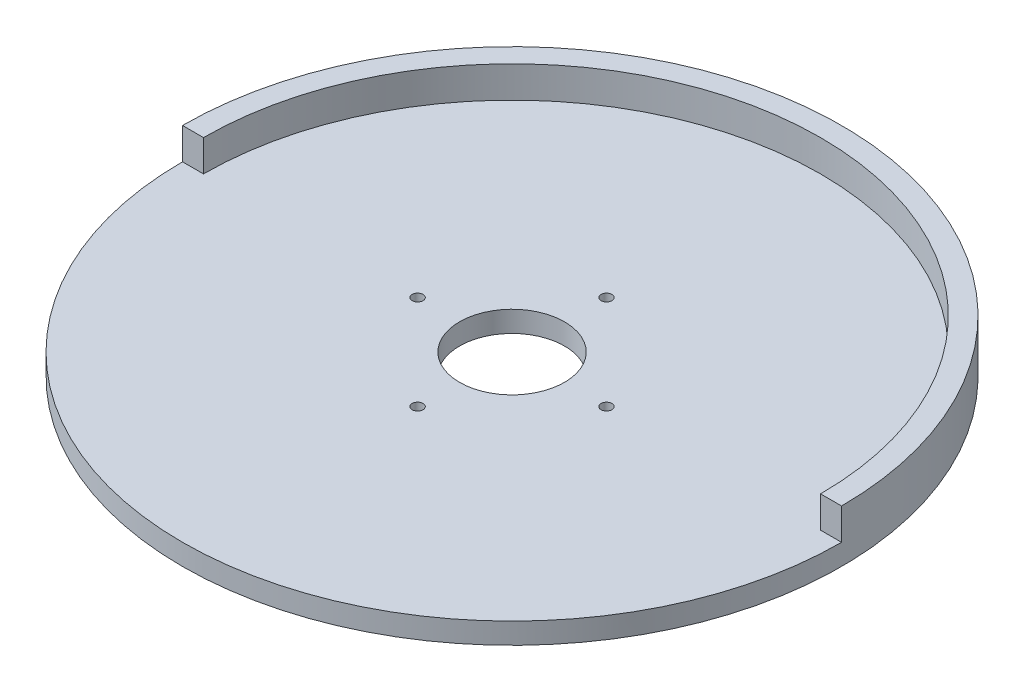
ISO-10303-21;
HEADER;
FILE_DESCRIPTION(('STEP AP214'),'2;1');
FILE_NAME('part.step','',(''),(''),'','','');
FILE_SCHEMA(('AUTOMOTIVE_DESIGN { 1 0 10303 214 1 1 1 1 }'));
ENDSEC;
DATA;
#1=APPLICATION_CONTEXT('core data for automotive mechanical design processes');
#2=APPLICATION_PROTOCOL_DEFINITION('international standard','automotive_design',2000,#1);
#3=PRODUCT_CONTEXT('',#1,'mechanical');
#4=PRODUCT('Part','Part','',(#3));
#5=PRODUCT_RELATED_PRODUCT_CATEGORY('part','',(#4));
#6=PRODUCT_DEFINITION_FORMATION('','',#4);
#7=PRODUCT_DEFINITION_CONTEXT('part definition',#1,'design');
#8=PRODUCT_DEFINITION('design','',#6,#7);
#9=PRODUCT_DEFINITION_SHAPE('','',#8);
#10=(LENGTH_UNIT() NAMED_UNIT(*) SI_UNIT(.MILLI.,.METRE.));
#11=(NAMED_UNIT(*) PLANE_ANGLE_UNIT() SI_UNIT($,.RADIAN.));
#12=(NAMED_UNIT(*) SI_UNIT($,.STERADIAN.) SOLID_ANGLE_UNIT());
#13=UNCERTAINTY_MEASURE_WITH_UNIT(LENGTH_MEASURE(1.E-05),#10,'distance_accuracy_value','');
#14=(GEOMETRIC_REPRESENTATION_CONTEXT(3) GLOBAL_UNCERTAINTY_ASSIGNED_CONTEXT((#13)) GLOBAL_UNIT_ASSIGNED_CONTEXT((#10,
#11,#12)) REPRESENTATION_CONTEXT('',''));
#15=CARTESIAN_POINT('',(0.,0.,0.));
#16=DIRECTION('',(0.,0.,1.));
#17=DIRECTION('',(1.,0.,0.));
#18=AXIS2_PLACEMENT_3D('',#15,#16,#17);
#19=CARTESIAN_POINT('',(0.,-10.,0.));
#20=DIRECTION('',(0.,1.,0.));
#21=DIRECTION('',(0.,0.,1.));
#22=AXIS2_PLACEMENT_3D('',#19,#20,#21);
#23=CYLINDRICAL_SURFACE('',#22,157.);
#24=CARTESIAN_POINT('',(0.,-10.,0.));
#25=DIRECTION('',(0.,1.,0.));
#26=DIRECTION('',(0.,0.,1.));
#27=AXIS2_PLACEMENT_3D('',#24,#25,#26);
#28=CIRCLE('',#27,157.);
#29=CARTESIAN_POINT('',(0.,-10.,157.));
#30=VERTEX_POINT('',#29);
#31=EDGE_CURVE('E11',#30,#30,#28,.T.);
#32=ORIENTED_EDGE('',*,*,#31,.T.);
#33=EDGE_LOOP('',(#32));
#34=FACE_BOUND('',#33,.T.);
#35=CARTESIAN_POINT('',(0.,0.,0.));
#36=DIRECTION('',(0.,1.,0.));
#37=DIRECTION('',(0.,0.,1.));
#38=AXIS2_PLACEMENT_3D('',#35,#36,#37);
#39=CIRCLE('',#38,157.);
#40=CARTESIAN_POINT('',(-157.,0.,0.));
#41=VERTEX_POINT('',#40);
#42=CARTESIAN_POINT('',(157.,0.,0.));
#43=VERTEX_POINT('',#42);
#44=EDGE_CURVE('E56',#41,#43,#39,.T.);
#45=ORIENTED_EDGE('',*,*,#44,.F.);
#46=DIRECTION('',(0.,-1.,0.));
#47=VECTOR('',#46,1.);
#48=CARTESIAN_POINT('',(-157.,15.,0.));
#49=LINE('',#48,#47);
#50=CARTESIAN_POINT('',(-157.,15.,0.));
#51=VERTEX_POINT('',#50);
#52=EDGE_CURVE('E132',#51,#41,#49,.T.);
#53=ORIENTED_EDGE('',*,*,#52,.F.);
#54=CARTESIAN_POINT('',(0.,15.,0.));
#55=DIRECTION('',(0.,1.,0.));
#56=DIRECTION('',(0.,0.,1.));
#57=AXIS2_PLACEMENT_3D('',#54,#55,#56);
#58=CIRCLE('',#57,157.);
#59=CARTESIAN_POINT('',(157.,15.,0.));
#60=VERTEX_POINT('',#59);
#61=EDGE_CURVE('E104',#60,#51,#58,.T.);
#62=ORIENTED_EDGE('',*,*,#61,.F.);
#63=DIRECTION('',(0.,-1.,0.));
#64=VECTOR('',#63,1.);
#65=CARTESIAN_POINT('',(157.,15.,0.));
#66=LINE('',#65,#64);
#67=EDGE_CURVE('E95',#60,#43,#66,.T.);
#68=ORIENTED_EDGE('',*,*,#67,.T.);
#69=EDGE_LOOP('',(#45,#53,#62,#68));
#70=FACE_BOUND('',#69,.T.);
#71=ADVANCED_FACE('F47',(#34,#70),#23,.T.);
#72=CARTESIAN_POINT('',(0.,-10.,0.));
#73=DIRECTION('',(0.,1.,0.));
#74=DIRECTION('',(0.,0.,1.));
#75=AXIS2_PLACEMENT_3D('',#72,#73,#74);
#76=PLANE('',#75);
#77=CARTESIAN_POINT('',(-45.,-10.,-1.57116660247941E-13));
#78=DIRECTION('',(0.,-1.,0.));
#79=DIRECTION('',(1.,0.,0.));
#80=AXIS2_PLACEMENT_3D('',#77,#78,#79);
#81=CIRCLE('',#80,2.6);
#82=CARTESIAN_POINT('',(-42.4,-10.,-1.48038808766949E-13));
#83=VERTEX_POINT('',#82);
#84=EDGE_CURVE('E149',#83,#83,#81,.T.);
#85=ORIENTED_EDGE('',*,*,#84,.F.);
#86=EDGE_LOOP('',(#85));
#87=FACE_BOUND('',#86,.T.);
#88=CARTESIAN_POINT('',(0.,-10.,-45.));
#89=DIRECTION('',(0.,-1.,0.));
#90=DIRECTION('',(0.,0.,1.));
#91=AXIS2_PLACEMENT_3D('',#88,#89,#90);
#92=CIRCLE('',#91,2.6);
#93=CARTESIAN_POINT('',(0.,-10.,-42.4));
#94=VERTEX_POINT('',#93);
#95=EDGE_CURVE('E279',#94,#94,#92,.T.);
#96=ORIENTED_EDGE('',*,*,#95,.F.);
#97=EDGE_LOOP('',(#96));
#98=FACE_BOUND('',#97,.T.);
#99=CARTESIAN_POINT('',(45.,-10.,4.71349980743823E-13));
#100=DIRECTION('',(0.,-1.,0.));
#101=DIRECTION('',(-1.,0.,0.));
#102=AXIS2_PLACEMENT_3D('',#99,#100,#101);
#103=CIRCLE('',#102,2.6);
#104=CARTESIAN_POINT('',(42.4,-10.,4.44116426300847E-13));
#105=VERTEX_POINT('',#104);
#106=EDGE_CURVE('E164',#105,#105,#103,.T.);
#107=ORIENTED_EDGE('',*,*,#106,.F.);
#108=EDGE_LOOP('',(#107));
#109=FACE_BOUND('',#108,.T.);
#110=CARTESIAN_POINT('',(0.,-10.,45.));
#111=DIRECTION('',(0.,-1.,0.));
#112=DIRECTION('',(0.,0.,-1.));
#113=AXIS2_PLACEMENT_3D('',#110,#111,#112);
#114=CIRCLE('',#113,2.6);
#115=CARTESIAN_POINT('',(0.,-10.,42.4));
#116=VERTEX_POINT('',#115);
#117=EDGE_CURVE('E144',#116,#116,#114,.T.);
#118=ORIENTED_EDGE('',*,*,#117,.F.);
#119=EDGE_LOOP('',(#118));
#120=FACE_BOUND('',#119,.T.);
#121=CARTESIAN_POINT('',(0.,-10.,0.));
#122=DIRECTION('',(0.,1.,0.));
#123=DIRECTION('',(0.,0.,1.));
#124=AXIS2_PLACEMENT_3D('',#121,#122,#123);
#125=CIRCLE('',#124,25.);
#126=CARTESIAN_POINT('',(0.,-10.,25.));
#127=VERTEX_POINT('',#126);
#128=EDGE_CURVE('E127',#127,#127,#125,.T.);
#129=ORIENTED_EDGE('',*,*,#128,.T.);
#130=EDGE_LOOP('',(#129));
#131=FACE_BOUND('',#130,.T.);
#132=ORIENTED_EDGE('',*,*,#31,.F.);
#133=EDGE_LOOP('',(#132));
#134=FACE_BOUND('',#133,.T.);
#135=ADVANCED_FACE('F178',(#87,#98,#109,#120,#131,#134),#76,.F.);
#136=CARTESIAN_POINT('',(0.,0.,0.));
#137=DIRECTION('',(0.,1.,0.));
#138=DIRECTION('',(0.,0.,1.));
#139=AXIS2_PLACEMENT_3D('',#136,#137,#138);
#140=PLANE('',#139);
#141=CARTESIAN_POINT('',(-45.,0.,-1.57116660247941E-13));
#142=DIRECTION('',(0.,1.,0.));
#143=DIRECTION('',(0.,0.,1.));
#144=AXIS2_PLACEMENT_3D('',#141,#142,#143);
#145=CIRCLE('',#144,2.6);
#146=CARTESIAN_POINT('',(-45.,0.,2.59999999999984));
#147=VERTEX_POINT('',#146);
#148=EDGE_CURVE('E50',#147,#147,#145,.T.);
#149=ORIENTED_EDGE('',*,*,#148,.F.);
#150=EDGE_LOOP('',(#149));
#151=FACE_BOUND('',#150,.T.);
#152=CARTESIAN_POINT('',(0.,0.,-45.));
#153=DIRECTION('',(0.,1.,0.));
#154=DIRECTION('',(0.,0.,1.));
#155=AXIS2_PLACEMENT_3D('',#152,#153,#154);
#156=CIRCLE('',#155,2.6);
#157=CARTESIAN_POINT('',(0.,0.,-42.4));
#158=VERTEX_POINT('',#157);
#159=EDGE_CURVE('E148',#158,#158,#156,.T.);
#160=ORIENTED_EDGE('',*,*,#159,.F.);
#161=EDGE_LOOP('',(#160));
#162=FACE_BOUND('',#161,.T.);
#163=CARTESIAN_POINT('',(45.,0.,4.71349980743823E-13));
#164=DIRECTION('',(0.,1.,0.));
#165=DIRECTION('',(0.,0.,1.));
#166=AXIS2_PLACEMENT_3D('',#163,#164,#165);
#167=CIRCLE('',#166,2.6);
#168=CARTESIAN_POINT('',(45.,0.,2.60000000000047));
#169=VERTEX_POINT('',#168);
#170=EDGE_CURVE('E145',#169,#169,#167,.T.);
#171=ORIENTED_EDGE('',*,*,#170,.F.);
#172=EDGE_LOOP('',(#171));
#173=FACE_BOUND('',#172,.T.);
#174=CARTESIAN_POINT('',(0.,0.,45.));
#175=DIRECTION('',(0.,1.,0.));
#176=DIRECTION('',(0.,0.,1.));
#177=AXIS2_PLACEMENT_3D('',#174,#175,#176);
#178=CIRCLE('',#177,2.6);
#179=CARTESIAN_POINT('',(0.,0.,47.6));
#180=VERTEX_POINT('',#179);
#181=EDGE_CURVE('E140',#180,#180,#178,.T.);
#182=ORIENTED_EDGE('',*,*,#181,.F.);
#183=EDGE_LOOP('',(#182));
#184=FACE_BOUND('',#183,.T.);
#185=CARTESIAN_POINT('',(0.,0.,0.));
#186=DIRECTION('',(0.,1.,0.));
#187=DIRECTION('',(0.,0.,1.));
#188=AXIS2_PLACEMENT_3D('',#185,#186,#187);
#189=CIRCLE('',#188,25.);
#190=CARTESIAN_POINT('',(0.,0.,25.));
#191=VERTEX_POINT('',#190);
#192=EDGE_CURVE('E117',#191,#191,#189,.T.);
#193=ORIENTED_EDGE('',*,*,#192,.F.);
#194=EDGE_LOOP('',(#193));
#195=FACE_BOUND('',#194,.T.);
#196=DIRECTION('',(1.,0.,0.));
#197=VECTOR('',#196,1.);
#198=CARTESIAN_POINT('',(0.,0.,0.));
#199=LINE('',#198,#197);
#200=CARTESIAN_POINT('',(-147.,0.,0.));
#201=VERTEX_POINT('',#200);
#202=EDGE_CURVE('E111',#41,#201,#199,.T.);
#203=ORIENTED_EDGE('',*,*,#202,.F.);
#204=ORIENTED_EDGE('',*,*,#44,.T.);
#205=DIRECTION('',(1.,0.,0.));
#206=VECTOR('',#205,1.);
#207=CARTESIAN_POINT('',(0.,0.,0.));
#208=LINE('',#207,#206);
#209=CARTESIAN_POINT('',(147.,0.,0.));
#210=VERTEX_POINT('',#209);
#211=EDGE_CURVE('E69',#210,#43,#208,.T.);
#212=ORIENTED_EDGE('',*,*,#211,.F.);
#213=CARTESIAN_POINT('',(0.,0.,0.));
#214=DIRECTION('',(0.,1.,0.));
#215=DIRECTION('',(0.,0.,1.));
#216=AXIS2_PLACEMENT_3D('',#213,#214,#215);
#217=CIRCLE('',#216,147.);
#218=EDGE_CURVE('E64',#210,#201,#217,.T.);
#219=ORIENTED_EDGE('',*,*,#218,.T.);
#220=EDGE_LOOP('',(#203,#204,#212,#219));
#221=FACE_BOUND('',#220,.T.);
#222=ADVANCED_FACE('F176',(#151,#162,#173,#184,#195,#221),#140,.T.);
#223=CARTESIAN_POINT('',(0.,15.,0.));
#224=DIRECTION('',(0.,-1.,0.));
#225=DIRECTION('',(0.,0.,-1.));
#226=AXIS2_PLACEMENT_3D('',#223,#224,#225);
#227=CYLINDRICAL_SURFACE('',#226,147.);
#228=ORIENTED_EDGE('',*,*,#218,.F.);
#229=DIRECTION('',(0.,-1.,0.));
#230=VECTOR('',#229,1.);
#231=CARTESIAN_POINT('',(147.,15.,0.));
#232=LINE('',#231,#230);
#233=CARTESIAN_POINT('',(147.,15.,0.));
#234=VERTEX_POINT('',#233);
#235=EDGE_CURVE('E88',#234,#210,#232,.T.);
#236=ORIENTED_EDGE('',*,*,#235,.F.);
#237=CARTESIAN_POINT('',(0.,15.,0.));
#238=DIRECTION('',(0.,1.,0.));
#239=DIRECTION('',(0.,0.,1.));
#240=AXIS2_PLACEMENT_3D('',#237,#238,#239);
#241=CIRCLE('',#240,147.);
#242=CARTESIAN_POINT('',(-147.,15.,0.));
#243=VERTEX_POINT('',#242);
#244=EDGE_CURVE('E92',#234,#243,#241,.T.);
#245=ORIENTED_EDGE('',*,*,#244,.T.);
#246=DIRECTION('',(0.,-1.,0.));
#247=VECTOR('',#246,1.);
#248=CARTESIAN_POINT('',(-147.,15.,0.));
#249=LINE('',#248,#247);
#250=EDGE_CURVE('E124',#243,#201,#249,.T.);
#251=ORIENTED_EDGE('',*,*,#250,.T.);
#252=EDGE_LOOP('',(#228,#236,#245,#251));
#253=FACE_BOUND('',#252,.T.);
#254=ADVANCED_FACE('F90',(#253),#227,.F.);
#255=CARTESIAN_POINT('',(0.,15.,0.));
#256=DIRECTION('',(0.,0.,-1.));
#257=DIRECTION('',(-1.,0.,0.));
#258=AXIS2_PLACEMENT_3D('',#255,#256,#257);
#259=PLANE('',#258);
#260=ORIENTED_EDGE('',*,*,#211,.T.);
#261=ORIENTED_EDGE('',*,*,#67,.F.);
#262=DIRECTION('',(1.,0.,0.));
#263=VECTOR('',#262,1.);
#264=CARTESIAN_POINT('',(0.,15.,0.));
#265=LINE('',#264,#263);
#266=EDGE_CURVE('E98',#234,#60,#265,.T.);
#267=ORIENTED_EDGE('',*,*,#266,.F.);
#268=ORIENTED_EDGE('',*,*,#235,.T.);
#269=EDGE_LOOP('',(#260,#261,#267,#268));
#270=FACE_BOUND('',#269,.T.);
#271=ADVANCED_FACE('F99',(#270),#259,.F.);
#272=CARTESIAN_POINT('',(0.,15.,0.));
#273=DIRECTION('',(0.,0.,-1.));
#274=DIRECTION('',(-1.,0.,0.));
#275=AXIS2_PLACEMENT_3D('',#272,#273,#274);
#276=PLANE('',#275);
#277=ORIENTED_EDGE('',*,*,#202,.T.);
#278=ORIENTED_EDGE('',*,*,#250,.F.);
#279=DIRECTION('',(1.,0.,0.));
#280=VECTOR('',#279,1.);
#281=CARTESIAN_POINT('',(0.,15.,0.));
#282=LINE('',#281,#280);
#283=EDGE_CURVE('E108',#51,#243,#282,.T.);
#284=ORIENTED_EDGE('',*,*,#283,.F.);
#285=ORIENTED_EDGE('',*,*,#52,.T.);
#286=EDGE_LOOP('',(#277,#278,#284,#285));
#287=FACE_BOUND('',#286,.T.);
#288=ADVANCED_FACE('F184',(#287),#276,.F.);
#289=CARTESIAN_POINT('',(0.,15.,0.));
#290=DIRECTION('',(0.,1.,0.));
#291=DIRECTION('',(0.,0.,1.));
#292=AXIS2_PLACEMENT_3D('',#289,#290,#291);
#293=PLANE('',#292);
#294=ORIENTED_EDGE('',*,*,#244,.F.);
#295=ORIENTED_EDGE('',*,*,#266,.T.);
#296=ORIENTED_EDGE('',*,*,#61,.T.);
#297=ORIENTED_EDGE('',*,*,#283,.T.);
#298=EDGE_LOOP('',(#294,#295,#296,#297));
#299=FACE_BOUND('',#298,.T.);
#300=ADVANCED_FACE('F106',(#299),#293,.T.);
#301=CARTESIAN_POINT('',(0.,-10.,0.));
#302=DIRECTION('',(0.,1.,0.));
#303=DIRECTION('',(0.,0.,1.));
#304=AXIS2_PLACEMENT_3D('',#301,#302,#303);
#305=CYLINDRICAL_SURFACE('',#304,25.);
#306=ORIENTED_EDGE('',*,*,#128,.F.);
#307=EDGE_LOOP('',(#306));
#308=FACE_BOUND('',#307,.T.);
#309=ORIENTED_EDGE('',*,*,#192,.T.);
#310=EDGE_LOOP('',(#309));
#311=FACE_BOUND('',#310,.T.);
#312=ADVANCED_FACE('F174',(#308,#311),#305,.F.);
#313=CARTESIAN_POINT('',(0.,15.,45.));
#314=DIRECTION('',(0.,-1.,0.));
#315=DIRECTION('',(0.,0.,-1.));
#316=AXIS2_PLACEMENT_3D('',#313,#314,#315);
#317=CYLINDRICAL_SURFACE('',#316,2.6);
#318=ORIENTED_EDGE('',*,*,#181,.T.);
#319=EDGE_LOOP('',(#318));
#320=FACE_BOUND('',#319,.T.);
#321=ORIENTED_EDGE('',*,*,#117,.T.);
#322=EDGE_LOOP('',(#321));
#323=FACE_BOUND('',#322,.T.);
#324=ADVANCED_FACE('F236',(#320,#323),#317,.F.);
#325=CARTESIAN_POINT('',(45.,15.,4.71349980743823E-13));
#326=DIRECTION('',(0.,-1.,0.));
#327=DIRECTION('',(0.,0.,-1.));
#328=AXIS2_PLACEMENT_3D('',#325,#326,#327);
#329=CYLINDRICAL_SURFACE('',#328,2.6);
#330=ORIENTED_EDGE('',*,*,#170,.T.);
#331=EDGE_LOOP('',(#330));
#332=FACE_BOUND('',#331,.T.);
#333=ORIENTED_EDGE('',*,*,#106,.T.);
#334=EDGE_LOOP('',(#333));
#335=FACE_BOUND('',#334,.T.);
#336=ADVANCED_FACE('F245',(#332,#335),#329,.F.);
#337=CARTESIAN_POINT('',(0.,15.,-45.));
#338=DIRECTION('',(0.,-1.,0.));
#339=DIRECTION('',(0.,0.,-1.));
#340=AXIS2_PLACEMENT_3D('',#337,#338,#339);
#341=CYLINDRICAL_SURFACE('',#340,2.6);
#342=ORIENTED_EDGE('',*,*,#159,.T.);
#343=EDGE_LOOP('',(#342));
#344=FACE_BOUND('',#343,.T.);
#345=ORIENTED_EDGE('',*,*,#95,.T.);
#346=EDGE_LOOP('',(#345));
#347=FACE_BOUND('',#346,.T.);
#348=ADVANCED_FACE('F255',(#344,#347),#341,.F.);
#349=CARTESIAN_POINT('',(-45.,15.,-1.57116660247941E-13));
#350=DIRECTION('',(0.,-1.,0.));
#351=DIRECTION('',(0.,0.,-1.));
#352=AXIS2_PLACEMENT_3D('',#349,#350,#351);
#353=CYLINDRICAL_SURFACE('',#352,2.6);
#354=ORIENTED_EDGE('',*,*,#148,.T.);
#355=EDGE_LOOP('',(#354));
#356=FACE_BOUND('',#355,.T.);
#357=ORIENTED_EDGE('',*,*,#84,.T.);
#358=EDGE_LOOP('',(#357));
#359=FACE_BOUND('',#358,.T.);
#360=ADVANCED_FACE('F265',(#356,#359),#353,.F.);
#361=CLOSED_SHELL('',(#71,#135,#222,#254,#271,#288,#300,#312,#324,#336,#348,#360));
#362=MANIFOLD_SOLID_BREP('B2',#361);
#363=ADVANCED_BREP_SHAPE_REPRESENTATION('',(#18,#362),#14);
#364=SHAPE_DEFINITION_REPRESENTATION(#9,#363);
ENDSEC;
END-ISO-10303-21;
